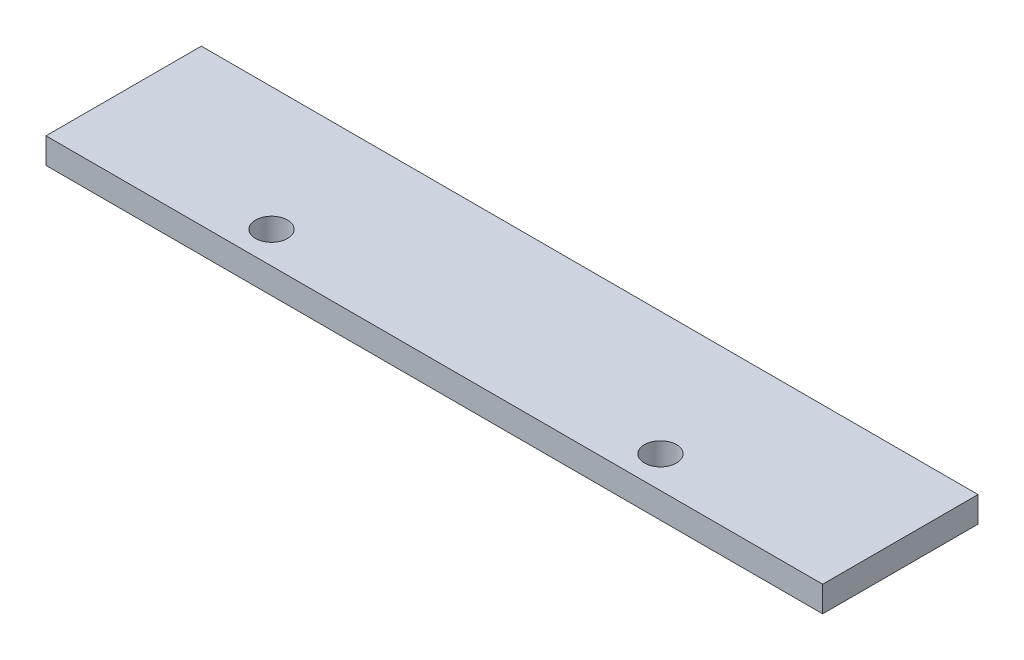
ISO-10303-21;
HEADER;
FILE_DESCRIPTION(('STEP AP214'),'2;1');
FILE_NAME('part.step','',(''),(''),'','','');
FILE_SCHEMA(('AUTOMOTIVE_DESIGN { 1 0 10303 214 1 1 1 1 }'));
ENDSEC;
DATA;
#1=APPLICATION_CONTEXT('core data for automotive mechanical design processes');
#2=APPLICATION_PROTOCOL_DEFINITION('international standard','automotive_design',2000,#1);
#3=PRODUCT_CONTEXT('',#1,'mechanical');
#4=PRODUCT('Part','Part','',(#3));
#5=PRODUCT_RELATED_PRODUCT_CATEGORY('part','',(#4));
#6=PRODUCT_DEFINITION_FORMATION('','',#4);
#7=PRODUCT_DEFINITION_CONTEXT('part definition',#1,'design');
#8=PRODUCT_DEFINITION('design','',#6,#7);
#9=PRODUCT_DEFINITION_SHAPE('','',#8);
#10=(LENGTH_UNIT() NAMED_UNIT(*) SI_UNIT(.MILLI.,.METRE.));
#11=(NAMED_UNIT(*) PLANE_ANGLE_UNIT() SI_UNIT($,.RADIAN.));
#12=(NAMED_UNIT(*) SI_UNIT($,.STERADIAN.) SOLID_ANGLE_UNIT());
#13=UNCERTAINTY_MEASURE_WITH_UNIT(LENGTH_MEASURE(1.E-05),#10,'distance_accuracy_value','');
#14=(GEOMETRIC_REPRESENTATION_CONTEXT(3) GLOBAL_UNCERTAINTY_ASSIGNED_CONTEXT((#13)) GLOBAL_UNIT_ASSIGNED_CONTEXT((#10,
#11,#12)) REPRESENTATION_CONTEXT('',''));
#15=CARTESIAN_POINT('',(0.,0.,0.));
#16=DIRECTION('',(0.,0.,1.));
#17=DIRECTION('',(1.,0.,0.));
#18=AXIS2_PLACEMENT_3D('',#15,#16,#17);
#19=CARTESIAN_POINT('',(25.55,0.845,5.11));
#20=DIRECTION('',(-1.,0.,0.));
#21=DIRECTION('',(0.,0.,1.));
#22=AXIS2_PLACEMENT_3D('',#19,#20,#21);
#23=PLANE('',#22);
#24=DIRECTION('',(0.,0.,-1.));
#25=VECTOR('',#24,1.);
#26=CARTESIAN_POINT('',(25.55,-0.845,5.11));
#27=LINE('',#26,#25);
#28=CARTESIAN_POINT('',(25.55,-0.845,5.11));
#29=VERTEX_POINT('',#28);
#30=CARTESIAN_POINT('',(25.55,-0.845,-5.11));
#31=VERTEX_POINT('',#30);
#32=EDGE_CURVE('E106',#29,#31,#27,.T.);
#33=ORIENTED_EDGE('',*,*,#32,.T.);
#34=DIRECTION('',(0.,-1.,0.));
#35=VECTOR('',#34,1.);
#36=CARTESIAN_POINT('',(25.55,0.845,-5.11));
#37=LINE('',#36,#35);
#38=CARTESIAN_POINT('',(25.55,0.845,-5.11));
#39=VERTEX_POINT('',#38);
#40=EDGE_CURVE('E11',#39,#31,#37,.T.);
#41=ORIENTED_EDGE('',*,*,#40,.F.);
#42=DIRECTION('',(0.,0.,-1.));
#43=VECTOR('',#42,1.);
#44=CARTESIAN_POINT('',(25.55,0.845,5.11));
#45=LINE('',#44,#43);
#46=CARTESIAN_POINT('',(25.55,0.845,5.11));
#47=VERTEX_POINT('',#46);
#48=EDGE_CURVE('E94',#47,#39,#45,.T.);
#49=ORIENTED_EDGE('',*,*,#48,.F.);
#50=DIRECTION('',(0.,-1.,0.));
#51=VECTOR('',#50,1.);
#52=CARTESIAN_POINT('',(25.55,0.845,5.11));
#53=LINE('',#52,#51);
#54=EDGE_CURVE('E102',#47,#29,#53,.T.);
#55=ORIENTED_EDGE('',*,*,#54,.T.);
#56=EDGE_LOOP('',(#33,#41,#49,#55));
#57=FACE_BOUND('',#56,.T.);
#58=ADVANCED_FACE('F43',(#57),#23,.F.);
#59=CARTESIAN_POINT('',(-25.55,0.845,-5.11));
#60=DIRECTION('',(0.,0.,1.));
#61=DIRECTION('',(1.,0.,0.));
#62=AXIS2_PLACEMENT_3D('',#59,#60,#61);
#63=PLANE('',#62);
#64=DIRECTION('',(-1.,0.,0.));
#65=VECTOR('',#64,1.);
#66=CARTESIAN_POINT('',(-25.55,-0.845,-5.11));
#67=LINE('',#66,#65);
#68=CARTESIAN_POINT('',(-25.55,-0.845,-5.11));
#69=VERTEX_POINT('',#68);
#70=EDGE_CURVE('E98',#31,#69,#67,.T.);
#71=ORIENTED_EDGE('',*,*,#70,.T.);
#72=DIRECTION('',(0.,-1.,0.));
#73=VECTOR('',#72,1.);
#74=CARTESIAN_POINT('',(-25.55,0.845,-5.11));
#75=LINE('',#74,#73);
#76=CARTESIAN_POINT('',(-25.55,0.845,-5.11));
#77=VERTEX_POINT('',#76);
#78=EDGE_CURVE('E51',#77,#69,#75,.T.);
#79=ORIENTED_EDGE('',*,*,#78,.F.);
#80=DIRECTION('',(-1.,0.,0.));
#81=VECTOR('',#80,1.);
#82=CARTESIAN_POINT('',(-25.55,0.845,-5.11));
#83=LINE('',#82,#81);
#84=EDGE_CURVE('E89',#39,#77,#83,.T.);
#85=ORIENTED_EDGE('',*,*,#84,.F.);
#86=ORIENTED_EDGE('',*,*,#40,.T.);
#87=EDGE_LOOP('',(#71,#79,#85,#86));
#88=FACE_BOUND('',#87,.T.);
#89=ADVANCED_FACE('F97',(#88),#63,.F.);
#90=CARTESIAN_POINT('',(-25.55,0.845,5.11));
#91=DIRECTION('',(1.,0.,0.));
#92=DIRECTION('',(0.,0.,-1.));
#93=AXIS2_PLACEMENT_3D('',#90,#91,#92);
#94=PLANE('',#93);
#95=DIRECTION('',(0.,0.,1.));
#96=VECTOR('',#95,1.);
#97=CARTESIAN_POINT('',(-25.55,-0.845,5.11));
#98=LINE('',#97,#96);
#99=CARTESIAN_POINT('',(-25.55,-0.845,5.11));
#100=VERTEX_POINT('',#99);
#101=EDGE_CURVE('E76',#69,#100,#98,.T.);
#102=ORIENTED_EDGE('',*,*,#101,.T.);
#103=DIRECTION('',(0.,-1.,0.));
#104=VECTOR('',#103,1.);
#105=CARTESIAN_POINT('',(-25.55,0.845,5.11));
#106=LINE('',#105,#104);
#107=CARTESIAN_POINT('',(-25.55,0.845,5.11));
#108=VERTEX_POINT('',#107);
#109=EDGE_CURVE('E99',#108,#100,#106,.T.);
#110=ORIENTED_EDGE('',*,*,#109,.F.);
#111=DIRECTION('',(0.,0.,1.));
#112=VECTOR('',#111,1.);
#113=CARTESIAN_POINT('',(-25.55,0.845,5.11));
#114=LINE('',#113,#112);
#115=EDGE_CURVE('E92',#77,#108,#114,.T.);
#116=ORIENTED_EDGE('',*,*,#115,.F.);
#117=ORIENTED_EDGE('',*,*,#78,.T.);
#118=EDGE_LOOP('',(#102,#110,#116,#117));
#119=FACE_BOUND('',#118,.T.);
#120=ADVANCED_FACE('F100',(#119),#94,.F.);
#121=CARTESIAN_POINT('',(-25.55,0.845,5.11));
#122=DIRECTION('',(0.,0.,-1.));
#123=DIRECTION('',(-1.,0.,0.));
#124=AXIS2_PLACEMENT_3D('',#121,#122,#123);
#125=PLANE('',#124);
#126=DIRECTION('',(1.,0.,0.));
#127=VECTOR('',#126,1.);
#128=CARTESIAN_POINT('',(-25.55,-0.845,5.11));
#129=LINE('',#128,#127);
#130=EDGE_CURVE('E82',#100,#29,#129,.T.);
#131=ORIENTED_EDGE('',*,*,#130,.T.);
#132=ORIENTED_EDGE('',*,*,#54,.F.);
#133=DIRECTION('',(1.,0.,0.));
#134=VECTOR('',#133,1.);
#135=CARTESIAN_POINT('',(-25.55,0.845,5.11));
#136=LINE('',#135,#134);
#137=EDGE_CURVE('E59',#108,#47,#136,.T.);
#138=ORIENTED_EDGE('',*,*,#137,.F.);
#139=ORIENTED_EDGE('',*,*,#109,.T.);
#140=EDGE_LOOP('',(#131,#132,#138,#139));
#141=FACE_BOUND('',#140,.T.);
#142=ADVANCED_FACE('F114',(#141),#125,.F.);
#143=CARTESIAN_POINT('',(0.,0.845,0.));
#144=DIRECTION('',(0.,-1.,0.));
#145=DIRECTION('',(0.,0.,-1.));
#146=AXIS2_PLACEMENT_3D('',#143,#144,#145);
#147=PLANE('',#146);
#148=CARTESIAN_POINT('',(12.7859935140557,0.845,3.01569041831463));
#149=DIRECTION('',(0.,1.,0.));
#150=DIRECTION('',(0.,0.,1.));
#151=AXIS2_PLACEMENT_3D('',#148,#149,#150);
#152=CIRCLE('',#151,1.05429477609712);
#153=CARTESIAN_POINT('',(12.7859935140557,0.845,4.06998519441175));
#154=VERTEX_POINT('',#153);
#155=EDGE_CURVE('E126',#154,#154,#152,.T.);
#156=ORIENTED_EDGE('',*,*,#155,.F.);
#157=EDGE_LOOP('',(#156));
#158=FACE_BOUND('',#157,.T.);
#159=CARTESIAN_POINT('',(-12.8064961916647,0.845,3.01569041831463));
#160=DIRECTION('',(0.,1.,0.));
#161=DIRECTION('',(0.,0.,1.));
#162=AXIS2_PLACEMENT_3D('',#159,#160,#161);
#163=CIRCLE('',#162,1.05429477609712);
#164=CARTESIAN_POINT('',(-12.8064961916647,0.845,4.06998519441175));
#165=VERTEX_POINT('',#164);
#166=EDGE_CURVE('E120',#165,#165,#163,.T.);
#167=ORIENTED_EDGE('',*,*,#166,.F.);
#168=EDGE_LOOP('',(#167));
#169=FACE_BOUND('',#168,.T.);
#170=ORIENTED_EDGE('',*,*,#48,.T.);
#171=ORIENTED_EDGE('',*,*,#84,.T.);
#172=ORIENTED_EDGE('',*,*,#115,.T.);
#173=ORIENTED_EDGE('',*,*,#137,.T.);
#174=EDGE_LOOP('',(#170,#171,#172,#173));
#175=FACE_BOUND('',#174,.T.);
#176=ADVANCED_FACE('F90',(#158,#169,#175),#147,.F.);
#177=CARTESIAN_POINT('',(0.,-0.845,0.));
#178=DIRECTION('',(0.,-1.,0.));
#179=DIRECTION('',(0.,0.,-1.));
#180=AXIS2_PLACEMENT_3D('',#177,#178,#179);
#181=PLANE('',#180);
#182=CARTESIAN_POINT('',(12.7859935140557,-0.845,3.01569041831463));
#183=DIRECTION('',(0.,1.,0.));
#184=DIRECTION('',(0.,0.,1.));
#185=AXIS2_PLACEMENT_3D('',#182,#183,#184);
#186=CIRCLE('',#185,1.05429477609712);
#187=CARTESIAN_POINT('',(12.7859935140557,-0.845,4.06998519441175));
#188=VERTEX_POINT('',#187);
#189=EDGE_CURVE('E123',#188,#188,#186,.T.);
#190=ORIENTED_EDGE('',*,*,#189,.T.);
#191=EDGE_LOOP('',(#190));
#192=FACE_BOUND('',#191,.T.);
#193=CARTESIAN_POINT('',(-12.8064961916647,-0.845,3.01569041831463));
#194=DIRECTION('',(0.,1.,0.));
#195=DIRECTION('',(0.,0.,1.));
#196=AXIS2_PLACEMENT_3D('',#193,#194,#195);
#197=CIRCLE('',#196,1.05429477609712);
#198=CARTESIAN_POINT('',(-12.8064961916647,-0.845,4.06998519441175));
#199=VERTEX_POINT('',#198);
#200=EDGE_CURVE('E109',#199,#199,#197,.T.);
#201=ORIENTED_EDGE('',*,*,#200,.T.);
#202=EDGE_LOOP('',(#201));
#203=FACE_BOUND('',#202,.T.);
#204=ORIENTED_EDGE('',*,*,#32,.F.);
#205=ORIENTED_EDGE('',*,*,#130,.F.);
#206=ORIENTED_EDGE('',*,*,#101,.F.);
#207=ORIENTED_EDGE('',*,*,#70,.F.);
#208=EDGE_LOOP('',(#204,#205,#206,#207));
#209=FACE_BOUND('',#208,.T.);
#210=ADVANCED_FACE('F117',(#192,#203,#209),#181,.T.);
#211=CARTESIAN_POINT('',(-12.8064961916647,-0.845,3.01569041831463));
#212=DIRECTION('',(0.,1.,0.));
#213=DIRECTION('',(0.,0.,1.));
#214=AXIS2_PLACEMENT_3D('',#211,#212,#213);
#215=CYLINDRICAL_SURFACE('',#214,1.05429477609712);
#216=CARTESIAN_POINT('',(-12.8064961916647,-0.845,4.06998519441175));
#217=CARTESIAN_POINT('',(-12.8064961916647,-0.827395833333333,4.06998519441175));
#218=CARTESIAN_POINT('',(-12.8064961916647,-0.809791666666667,4.06998519441175));
#219=CARTESIAN_POINT('',(-12.8064961916647,-0.774583333333333,4.06998519441175));
#220=CARTESIAN_POINT('',(-12.8064961916647,-0.756979166666667,4.06998519441175));
#221=CARTESIAN_POINT('',(-12.8064961916647,-0.721770833333333,4.06998519441175));
#222=CARTESIAN_POINT('',(-12.8064961916647,-0.704166666666667,4.06998519441175));
#223=CARTESIAN_POINT('',(-12.8064961916647,-0.668958333333333,4.06998519441175));
#224=CARTESIAN_POINT('',(-12.8064961916647,-0.651354166666667,4.06998519441175));
#225=CARTESIAN_POINT('',(-12.8064961916647,-0.616145833333333,4.06998519441175));
#226=CARTESIAN_POINT('',(-12.8064961916647,-0.598541666666667,4.06998519441175));
#227=CARTESIAN_POINT('',(-12.8064961916647,-0.563333333333333,4.06998519441175));
#228=CARTESIAN_POINT('',(-12.8064961916647,-0.545729166666667,4.06998519441175));
#229=CARTESIAN_POINT('',(-12.8064961916647,-0.510520833333333,4.06998519441175));
#230=CARTESIAN_POINT('',(-12.8064961916647,-0.492916666666667,4.06998519441175));
#231=CARTESIAN_POINT('',(-12.8064961916647,-0.457708333333333,4.06998519441175));
#232=CARTESIAN_POINT('',(-12.8064961916647,-0.440104166666667,4.06998519441175));
#233=CARTESIAN_POINT('',(-12.8064961916647,-0.404895833333333,4.06998519441175));
#234=CARTESIAN_POINT('',(-12.8064961916647,-0.387291666666667,4.06998519441175));
#235=CARTESIAN_POINT('',(-12.8064961916647,-0.352083333333333,4.06998519441175));
#236=CARTESIAN_POINT('',(-12.8064961916647,-0.334479166666667,4.06998519441175));
#237=CARTESIAN_POINT('',(-12.8064961916647,-0.299270833333333,4.06998519441175));
#238=CARTESIAN_POINT('',(-12.8064961916647,-0.281666666666667,4.06998519441175));
#239=CARTESIAN_POINT('',(-12.8064961916647,-0.246458333333333,4.06998519441175));
#240=CARTESIAN_POINT('',(-12.8064961916647,-0.228854166666667,4.06998519441175));
#241=CARTESIAN_POINT('',(-12.8064961916647,-0.193645833333333,4.06998519441175));
#242=CARTESIAN_POINT('',(-12.8064961916647,-0.176041666666667,4.06998519441175));
#243=CARTESIAN_POINT('',(-12.8064961916647,-0.140833333333334,4.06998519441175));
#244=CARTESIAN_POINT('',(-12.8064961916647,-0.123229166666667,4.06998519441175));
#245=CARTESIAN_POINT('',(-12.8064961916647,-0.0880208333333335,4.06998519441175));
#246=CARTESIAN_POINT('',(-12.8064961916647,-0.0704166666666668,4.06998519441175));
#247=CARTESIAN_POINT('',(-12.8064961916647,-0.0352083333333335,4.06998519441175));
#248=CARTESIAN_POINT('',(-12.8064961916647,-0.0176041666666668,4.06998519441175));
#249=CARTESIAN_POINT('',(-12.8064961916647,0.0176041666666666,4.06998519441175));
#250=CARTESIAN_POINT('',(-12.8064961916647,0.0352083333333332,4.06998519441175));
#251=CARTESIAN_POINT('',(-12.8064961916647,0.0704166666666666,4.06998519441175));
#252=CARTESIAN_POINT('',(-12.8064961916647,0.0880208333333332,4.06998519441175));
#253=CARTESIAN_POINT('',(-12.8064961916647,0.123229166666667,4.06998519441175));
#254=CARTESIAN_POINT('',(-12.8064961916647,0.140833333333333,4.06998519441175));
#255=CARTESIAN_POINT('',(-12.8064961916647,0.176041666666667,4.06998519441175));
#256=CARTESIAN_POINT('',(-12.8064961916647,0.193645833333333,4.06998519441175));
#257=CARTESIAN_POINT('',(-12.8064961916647,0.228854166666667,4.06998519441175));
#258=CARTESIAN_POINT('',(-12.8064961916647,0.246458333333333,4.06998519441175));
#259=CARTESIAN_POINT('',(-12.8064961916647,0.281666666666667,4.06998519441175));
#260=CARTESIAN_POINT('',(-12.8064961916647,0.299270833333333,4.06998519441175));
#261=CARTESIAN_POINT('',(-12.8064961916647,0.334479166666667,4.06998519441175));
#262=CARTESIAN_POINT('',(-12.8064961916647,0.352083333333333,4.06998519441175));
#263=CARTESIAN_POINT('',(-12.8064961916647,0.387291666666667,4.06998519441175));
#264=CARTESIAN_POINT('',(-12.8064961916647,0.404895833333333,4.06998519441175));
#265=CARTESIAN_POINT('',(-12.8064961916647,0.440104166666667,4.06998519441175));
#266=CARTESIAN_POINT('',(-12.8064961916647,0.457708333333333,4.06998519441175));
#267=CARTESIAN_POINT('',(-12.8064961916647,0.492916666666667,4.06998519441175));
#268=CARTESIAN_POINT('',(-12.8064961916647,0.510520833333333,4.06998519441175));
#269=CARTESIAN_POINT('',(-12.8064961916647,0.545729166666667,4.06998519441175));
#270=CARTESIAN_POINT('',(-12.8064961916647,0.563333333333333,4.06998519441175));
#271=CARTESIAN_POINT('',(-12.8064961916647,0.598541666666667,4.06998519441175));
#272=CARTESIAN_POINT('',(-12.8064961916647,0.616145833333333,4.06998519441175));
#273=CARTESIAN_POINT('',(-12.8064961916647,0.651354166666667,4.06998519441175));
#274=CARTESIAN_POINT('',(-12.8064961916647,0.668958333333333,4.06998519441175));
#275=CARTESIAN_POINT('',(-12.8064961916647,0.704166666666667,4.06998519441175));
#276=CARTESIAN_POINT('',(-12.8064961916647,0.721770833333333,4.06998519441175));
#277=CARTESIAN_POINT('',(-12.8064961916647,0.756979166666667,4.06998519441175));
#278=CARTESIAN_POINT('',(-12.8064961916647,0.774583333333333,4.06998519441175));
#279=CARTESIAN_POINT('',(-12.8064961916647,0.809791666666667,4.06998519441175));
#280=CARTESIAN_POINT('',(-12.8064961916647,0.827395833333333,4.06998519441175));
#281=CARTESIAN_POINT('',(-12.8064961916647,0.845,4.06998519441175));
#282=B_SPLINE_CURVE_WITH_KNOTS('',3,(#216,#217,#218,#219,#220,#221,#222,#223,#224,#225,#226,
#227,#228,#229,#230,#231,#232,#233,#234,#235,#236,#237,#238,#239,#240,#241,#242,#243,#244,#245,
#246,#247,#248,#249,#250,#251,#252,#253,#254,#255,#256,#257,#258,#259,#260,#261,#262,#263,#264,
#265,#266,#267,#268,#269,#270,#271,#272,#273,#274,#275,#276,#277,#278,#279,#280,#281),
.UNSPECIFIED.,.F.,.F.,(4,2,2,2,2,2,2,2,2,2,2,2,2,2,2,2,2,2,2,2,2,2,2,2,2,2,2,2,2,2,2,2,4),(0.,
0.0528125,0.105625,0.1584375,0.21125,0.2640625,0.316875,0.3696875,0.4225,0.4753125,0.528125,
0.5809375,0.63375,0.6865625,0.739375,0.7921875,0.845,0.8978125,0.950625,1.0034375,1.05625,
1.1090625,1.161875,1.2146875,1.2675,1.3203125,1.373125,1.4259375,1.47875,1.5315625,1.584375,
1.6371875,1.69),.UNSPECIFIED.);
#283=EDGE_CURVE('BSEAM137',#199,#165,#282,.T.);
#284=ORIENTED_EDGE('',*,*,#200,.F.);
#285=ORIENTED_EDGE('',*,*,#166,.T.);
#286=ORIENTED_EDGE('',*,*,#283,.T.);
#287=ORIENTED_EDGE('',*,*,#283,.F.);
#288=EDGE_LOOP('',(#284,#286,#285,#287));
#289=FACE_BOUND('',#288,.T.);
#290=ADVANCED_FACE('F137',(#289),#215,.F.);
#291=CARTESIAN_POINT('',(12.7859935140557,-0.845,3.01569041831463));
#292=DIRECTION('',(0.,1.,0.));
#293=DIRECTION('',(0.,0.,1.));
#294=AXIS2_PLACEMENT_3D('',#291,#292,#293);
#295=CYLINDRICAL_SURFACE('',#294,1.05429477609712);
#296=CARTESIAN_POINT('',(12.7859935140557,-0.845,4.06998519441175));
#297=CARTESIAN_POINT('',(12.7859935140557,-0.827395833333333,4.06998519441175));
#298=CARTESIAN_POINT('',(12.7859935140557,-0.809791666666667,4.06998519441175));
#299=CARTESIAN_POINT('',(12.7859935140557,-0.774583333333333,4.06998519441175));
#300=CARTESIAN_POINT('',(12.7859935140557,-0.756979166666667,4.06998519441175));
#301=CARTESIAN_POINT('',(12.7859935140557,-0.721770833333333,4.06998519441175));
#302=CARTESIAN_POINT('',(12.7859935140557,-0.704166666666667,4.06998519441175));
#303=CARTESIAN_POINT('',(12.7859935140557,-0.668958333333333,4.06998519441175));
#304=CARTESIAN_POINT('',(12.7859935140557,-0.651354166666667,4.06998519441175));
#305=CARTESIAN_POINT('',(12.7859935140557,-0.616145833333333,4.06998519441175));
#306=CARTESIAN_POINT('',(12.7859935140557,-0.598541666666667,4.06998519441175));
#307=CARTESIAN_POINT('',(12.7859935140557,-0.563333333333333,4.06998519441175));
#308=CARTESIAN_POINT('',(12.7859935140557,-0.545729166666667,4.06998519441175));
#309=CARTESIAN_POINT('',(12.7859935140557,-0.510520833333333,4.06998519441175));
#310=CARTESIAN_POINT('',(12.7859935140557,-0.492916666666667,4.06998519441175));
#311=CARTESIAN_POINT('',(12.7859935140557,-0.457708333333333,4.06998519441175));
#312=CARTESIAN_POINT('',(12.7859935140557,-0.440104166666667,4.06998519441175));
#313=CARTESIAN_POINT('',(12.7859935140557,-0.404895833333333,4.06998519441175));
#314=CARTESIAN_POINT('',(12.7859935140557,-0.387291666666667,4.06998519441175));
#315=CARTESIAN_POINT('',(12.7859935140557,-0.352083333333333,4.06998519441175));
#316=CARTESIAN_POINT('',(12.7859935140557,-0.334479166666667,4.06998519441175));
#317=CARTESIAN_POINT('',(12.7859935140557,-0.299270833333333,4.06998519441175));
#318=CARTESIAN_POINT('',(12.7859935140557,-0.281666666666667,4.06998519441175));
#319=CARTESIAN_POINT('',(12.7859935140557,-0.246458333333333,4.06998519441175));
#320=CARTESIAN_POINT('',(12.7859935140557,-0.228854166666667,4.06998519441175));
#321=CARTESIAN_POINT('',(12.7859935140557,-0.193645833333333,4.06998519441175));
#322=CARTESIAN_POINT('',(12.7859935140557,-0.176041666666667,4.06998519441175));
#323=CARTESIAN_POINT('',(12.7859935140557,-0.140833333333334,4.06998519441175));
#324=CARTESIAN_POINT('',(12.7859935140557,-0.123229166666667,4.06998519441175));
#325=CARTESIAN_POINT('',(12.7859935140557,-0.0880208333333335,4.06998519441175));
#326=CARTESIAN_POINT('',(12.7859935140557,-0.0704166666666668,4.06998519441175));
#327=CARTESIAN_POINT('',(12.7859935140557,-0.0352083333333335,4.06998519441175));
#328=CARTESIAN_POINT('',(12.7859935140557,-0.0176041666666668,4.06998519441175));
#329=CARTESIAN_POINT('',(12.7859935140557,0.0176041666666666,4.06998519441175));
#330=CARTESIAN_POINT('',(12.7859935140557,0.0352083333333332,4.06998519441175));
#331=CARTESIAN_POINT('',(12.7859935140557,0.0704166666666666,4.06998519441175));
#332=CARTESIAN_POINT('',(12.7859935140557,0.0880208333333332,4.06998519441175));
#333=CARTESIAN_POINT('',(12.7859935140557,0.123229166666667,4.06998519441175));
#334=CARTESIAN_POINT('',(12.7859935140557,0.140833333333333,4.06998519441175));
#335=CARTESIAN_POINT('',(12.7859935140557,0.176041666666667,4.06998519441175));
#336=CARTESIAN_POINT('',(12.7859935140557,0.193645833333333,4.06998519441175));
#337=CARTESIAN_POINT('',(12.7859935140557,0.228854166666667,4.06998519441175));
#338=CARTESIAN_POINT('',(12.7859935140557,0.246458333333333,4.06998519441175));
#339=CARTESIAN_POINT('',(12.7859935140557,0.281666666666667,4.06998519441175));
#340=CARTESIAN_POINT('',(12.7859935140557,0.299270833333333,4.06998519441175));
#341=CARTESIAN_POINT('',(12.7859935140557,0.334479166666667,4.06998519441175));
#342=CARTESIAN_POINT('',(12.7859935140557,0.352083333333333,4.06998519441175));
#343=CARTESIAN_POINT('',(12.7859935140557,0.387291666666667,4.06998519441175));
#344=CARTESIAN_POINT('',(12.7859935140557,0.404895833333333,4.06998519441175));
#345=CARTESIAN_POINT('',(12.7859935140557,0.440104166666667,4.06998519441175));
#346=CARTESIAN_POINT('',(12.7859935140557,0.457708333333333,4.06998519441175));
#347=CARTESIAN_POINT('',(12.7859935140557,0.492916666666667,4.06998519441175));
#348=CARTESIAN_POINT('',(12.7859935140557,0.510520833333333,4.06998519441175));
#349=CARTESIAN_POINT('',(12.7859935140557,0.545729166666667,4.06998519441175));
#350=CARTESIAN_POINT('',(12.7859935140557,0.563333333333333,4.06998519441175));
#351=CARTESIAN_POINT('',(12.7859935140557,0.598541666666667,4.06998519441175));
#352=CARTESIAN_POINT('',(12.7859935140557,0.616145833333333,4.06998519441175));
#353=CARTESIAN_POINT('',(12.7859935140557,0.651354166666667,4.06998519441175));
#354=CARTESIAN_POINT('',(12.7859935140557,0.668958333333333,4.06998519441175));
#355=CARTESIAN_POINT('',(12.7859935140557,0.704166666666667,4.06998519441175));
#356=CARTESIAN_POINT('',(12.7859935140557,0.721770833333333,4.06998519441175));
#357=CARTESIAN_POINT('',(12.7859935140557,0.756979166666667,4.06998519441175));
#358=CARTESIAN_POINT('',(12.7859935140557,0.774583333333333,4.06998519441175));
#359=CARTESIAN_POINT('',(12.7859935140557,0.809791666666667,4.06998519441175));
#360=CARTESIAN_POINT('',(12.7859935140557,0.827395833333333,4.06998519441175));
#361=CARTESIAN_POINT('',(12.7859935140557,0.845,4.06998519441175));
#362=B_SPLINE_CURVE_WITH_KNOTS('',3,(#296,#297,#298,#299,#300,#301,#302,#303,#304,#305,#306,
#307,#308,#309,#310,#311,#312,#313,#314,#315,#316,#317,#318,#319,#320,#321,#322,#323,#324,#325,
#326,#327,#328,#329,#330,#331,#332,#333,#334,#335,#336,#337,#338,#339,#340,#341,#342,#343,#344,
#345,#346,#347,#348,#349,#350,#351,#352,#353,#354,#355,#356,#357,#358,#359,#360,#361),
.UNSPECIFIED.,.F.,.F.,(4,2,2,2,2,2,2,2,2,2,2,2,2,2,2,2,2,2,2,2,2,2,2,2,2,2,2,2,2,2,2,2,4),(0.,
0.0528125,0.105625,0.1584375,0.21125,0.2640625,0.316875,0.3696875,0.4225,0.4753125,0.528125,
0.5809375,0.63375,0.6865625,0.739375,0.7921875,0.845,0.8978125,0.950625,1.0034375,1.05625,
1.1090625,1.161875,1.2146875,1.2675,1.3203125,1.373125,1.4259375,1.47875,1.5315625,1.584375,
1.6371875,1.69),.UNSPECIFIED.);
#363=EDGE_CURVE('BSEAM134',#188,#154,#362,.T.);
#364=ORIENTED_EDGE('',*,*,#189,.F.);
#365=ORIENTED_EDGE('',*,*,#155,.T.);
#366=ORIENTED_EDGE('',*,*,#363,.T.);
#367=ORIENTED_EDGE('',*,*,#363,.F.);
#368=EDGE_LOOP('',(#364,#366,#365,#367));
#369=FACE_BOUND('',#368,.T.);
#370=ADVANCED_FACE('F134',(#369),#295,.F.);
#371=CLOSED_SHELL('',(#58,#89,#120,#142,#176,#210,#290,#370));
#372=MANIFOLD_SOLID_BREP('B2',#371);
#373=ADVANCED_BREP_SHAPE_REPRESENTATION('',(#18,#372),#14);
#374=SHAPE_DEFINITION_REPRESENTATION(#9,#373);
ENDSEC;
END-ISO-10303-21;
